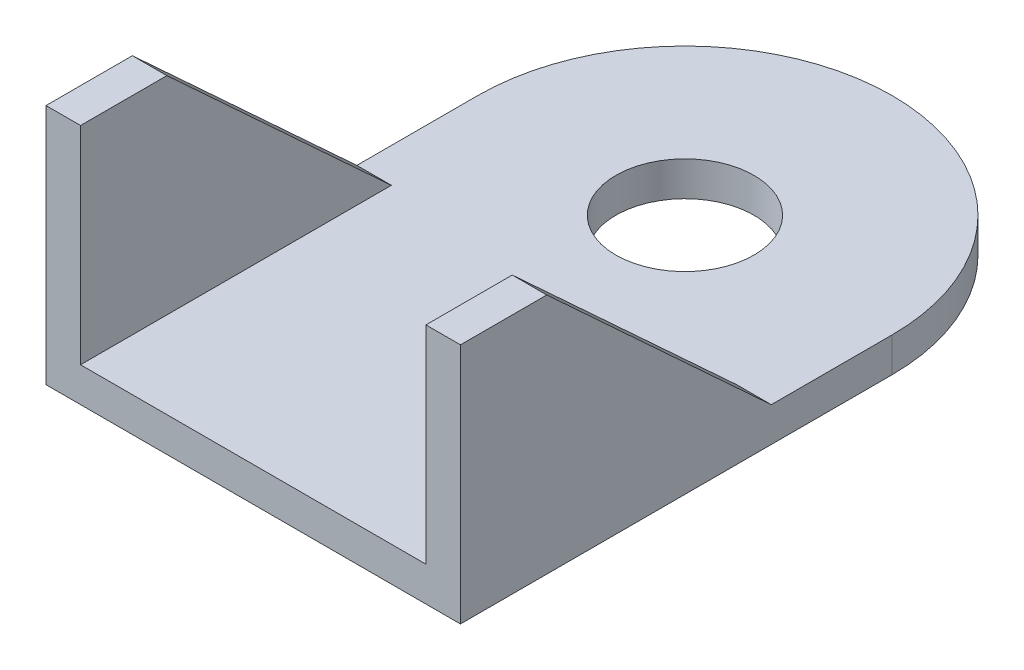
ISO-10303-21;
HEADER;
FILE_DESCRIPTION(('STEP AP214'),'2;1');
FILE_NAME('part.step','',(''),(''),'','','');
FILE_SCHEMA(('AUTOMOTIVE_DESIGN { 1 0 10303 214 1 1 1 1 }'));
ENDSEC;
DATA;
#1=APPLICATION_CONTEXT('core data for automotive mechanical design processes');
#2=APPLICATION_PROTOCOL_DEFINITION('international standard','automotive_design',2000,#1);
#3=PRODUCT_CONTEXT('',#1,'mechanical');
#4=PRODUCT('Part','Part','',(#3));
#5=PRODUCT_RELATED_PRODUCT_CATEGORY('part','',(#4));
#6=PRODUCT_DEFINITION_FORMATION('','',#4);
#7=PRODUCT_DEFINITION_CONTEXT('part definition',#1,'design');
#8=PRODUCT_DEFINITION('design','',#6,#7);
#9=PRODUCT_DEFINITION_SHAPE('','',#8);
#10=(LENGTH_UNIT() NAMED_UNIT(*) SI_UNIT(.MILLI.,.METRE.));
#11=(NAMED_UNIT(*) PLANE_ANGLE_UNIT() SI_UNIT($,.RADIAN.));
#12=(NAMED_UNIT(*) SI_UNIT($,.STERADIAN.) SOLID_ANGLE_UNIT());
#13=UNCERTAINTY_MEASURE_WITH_UNIT(LENGTH_MEASURE(1.E-05),#10,'distance_accuracy_value','');
#14=(GEOMETRIC_REPRESENTATION_CONTEXT(3) GLOBAL_UNCERTAINTY_ASSIGNED_CONTEXT((#13)) GLOBAL_UNIT_ASSIGNED_CONTEXT((#10,
#11,#12)) REPRESENTATION_CONTEXT('',''));
#15=CARTESIAN_POINT('',(0.,0.,0.));
#16=DIRECTION('',(0.,0.,1.));
#17=DIRECTION('',(1.,0.,0.));
#18=AXIS2_PLACEMENT_3D('',#15,#16,#17);
#19=CARTESIAN_POINT('',(0.,0.,0.));
#20=DIRECTION('',(0.,1.,0.));
#21=DIRECTION('',(0.,0.,1.));
#22=AXIS2_PLACEMENT_3D('',#19,#20,#21);
#23=PLANE('',#22);
#24=CARTESIAN_POINT('',(0.,0.,0.));
#25=DIRECTION('',(0.,1.,0.));
#26=DIRECTION('',(0.,0.,1.));
#27=AXIS2_PLACEMENT_3D('',#24,#25,#26);
#28=CIRCLE('',#27,12.);
#29=CARTESIAN_POINT('',(12.,0.,0.));
#30=VERTEX_POINT('',#29);
#31=CARTESIAN_POINT('',(-12.,0.,0.));
#32=VERTEX_POINT('',#31);
#33=EDGE_CURVE('E11',#30,#32,#28,.F.);
#34=ORIENTED_EDGE('',*,*,#33,.F.);
#35=DIRECTION('',(0.,0.,-1.));
#36=VECTOR('',#35,1.);
#37=CARTESIAN_POINT('',(12.,0.,0.));
#38=LINE('',#37,#36);
#39=CARTESIAN_POINT('',(12.,0.,25.));
#40=VERTEX_POINT('',#39);
#41=EDGE_CURVE('E172',#40,#30,#38,.T.);
#42=ORIENTED_EDGE('',*,*,#41,.F.);
#43=DIRECTION('',(1.,0.,0.));
#44=VECTOR('',#43,1.);
#45=CARTESIAN_POINT('',(0.,0.,25.));
#46=LINE('',#45,#44);
#47=CARTESIAN_POINT('',(-12.,0.,25.));
#48=VERTEX_POINT('',#47);
#49=EDGE_CURVE('E193',#48,#40,#46,.T.);
#50=ORIENTED_EDGE('',*,*,#49,.F.);
#51=DIRECTION('',(0.,0.,1.));
#52=VECTOR('',#51,1.);
#53=CARTESIAN_POINT('',(-12.,0.,0.));
#54=LINE('',#53,#52);
#55=EDGE_CURVE('E191',#32,#48,#54,.T.);
#56=ORIENTED_EDGE('',*,*,#55,.F.);
#57=EDGE_LOOP('',(#34,#42,#50,#56));
#58=FACE_BOUND('',#57,.T.);
#59=ADVANCED_FACE('F40',(#58),#23,.F.);
#60=CARTESIAN_POINT('',(0.,0.,0.));
#61=DIRECTION('',(0.,1.,0.));
#62=DIRECTION('',(0.,0.,1.));
#63=AXIS2_PLACEMENT_3D('',#60,#61,#62);
#64=CIRCLE('',#63,12.);
#65=EDGE_CURVE('E188',#30,#32,#64,.T.);
#66=ORIENTED_EDGE('',*,*,#65,.F.);
#67=ORIENTED_EDGE('',*,*,#33,.T.);
#68=EDGE_LOOP('',(#66,#67));
#69=FACE_BOUND('',#68,.T.);
#70=CARTESIAN_POINT('',(0.,0.,0.));
#71=DIRECTION('',(0.,1.,0.));
#72=DIRECTION('',(0.,0.,1.));
#73=AXIS2_PLACEMENT_3D('',#70,#71,#72);
#74=CIRCLE('',#73,9.);
#75=CARTESIAN_POINT('',(0.,0.,9.));
#76=VERTEX_POINT('',#75);
#77=EDGE_CURVE('E49',#76,#76,#74,.F.);
#78=ORIENTED_EDGE('',*,*,#77,.F.);
#79=EDGE_LOOP('',(#78));
#80=FACE_BOUND('',#79,.T.);
#81=ADVANCED_FACE('F216',(#69,#80),#23,.F.);
#82=CARTESIAN_POINT('',(0.,2.,0.));
#83=DIRECTION('',(0.,1.,0.));
#84=DIRECTION('',(0.,0.,1.));
#85=AXIS2_PLACEMENT_3D('',#82,#83,#84);
#86=PLANE('',#85);
#87=CARTESIAN_POINT('',(0.,2.,0.));
#88=DIRECTION('',(0.,1.,0.));
#89=DIRECTION('',(0.,0.,1.));
#90=AXIS2_PLACEMENT_3D('',#87,#88,#89);
#91=CIRCLE('',#90,4.);
#92=CARTESIAN_POINT('',(0.,2.,4.));
#93=VERTEX_POINT('',#92);
#94=EDGE_CURVE('E126',#93,#93,#91,.T.);
#95=ORIENTED_EDGE('',*,*,#94,.F.);
#96=EDGE_LOOP('',(#95));
#97=FACE_BOUND('',#96,.T.);
#98=DIRECTION('',(0.,0.,1.));
#99=VECTOR('',#98,1.);
#100=CARTESIAN_POINT('',(-12.,2.,0.));
#101=LINE('',#100,#99);
#102=CARTESIAN_POINT('',(-12.,2.,0.));
#103=VERTEX_POINT('',#102);
#104=CARTESIAN_POINT('',(-12.,2.,7.));
#105=VERTEX_POINT('',#104);
#106=EDGE_CURVE('E61',#103,#105,#101,.T.);
#107=ORIENTED_EDGE('',*,*,#106,.T.);
#108=DIRECTION('',(-1.,0.,0.));
#109=VECTOR('',#108,1.);
#110=CARTESIAN_POINT('',(-10.,2.,7.));
#111=LINE('',#110,#109);
#112=CARTESIAN_POINT('',(-10.,2.,7.));
#113=VERTEX_POINT('',#112);
#114=EDGE_CURVE('E56',#113,#105,#111,.T.);
#115=ORIENTED_EDGE('',*,*,#114,.F.);
#116=DIRECTION('',(0.,0.,-1.));
#117=VECTOR('',#116,1.);
#118=CARTESIAN_POINT('',(-10.,2.,7.));
#119=LINE('',#118,#117);
#120=CARTESIAN_POINT('',(-10.,2.,25.));
#121=VERTEX_POINT('',#120);
#122=EDGE_CURVE('E129',#121,#113,#119,.T.);
#123=ORIENTED_EDGE('',*,*,#122,.F.);
#124=DIRECTION('',(1.,0.,0.));
#125=VECTOR('',#124,1.);
#126=CARTESIAN_POINT('',(0.,2.,25.));
#127=LINE('',#126,#125);
#128=CARTESIAN_POINT('',(10.,2.,25.));
#129=VERTEX_POINT('',#128);
#130=EDGE_CURVE('E117',#121,#129,#127,.T.);
#131=ORIENTED_EDGE('',*,*,#130,.T.);
#132=DIRECTION('',(0.,0.,-1.));
#133=VECTOR('',#132,1.);
#134=CARTESIAN_POINT('',(10.,2.,7.));
#135=LINE('',#134,#133);
#136=CARTESIAN_POINT('',(10.,2.,7.));
#137=VERTEX_POINT('',#136);
#138=EDGE_CURVE('E154',#129,#137,#135,.T.);
#139=ORIENTED_EDGE('',*,*,#138,.T.);
#140=DIRECTION('',(1.,0.,0.));
#141=VECTOR('',#140,1.);
#142=CARTESIAN_POINT('',(10.,2.,7.));
#143=LINE('',#142,#141);
#144=CARTESIAN_POINT('',(12.,2.,7.));
#145=VERTEX_POINT('',#144);
#146=EDGE_CURVE('E164',#137,#145,#143,.T.);
#147=ORIENTED_EDGE('',*,*,#146,.T.);
#148=DIRECTION('',(0.,0.,-1.));
#149=VECTOR('',#148,1.);
#150=CARTESIAN_POINT('',(12.,2.,0.));
#151=LINE('',#150,#149);
#152=CARTESIAN_POINT('',(12.,2.,0.));
#153=VERTEX_POINT('',#152);
#154=EDGE_CURVE('E177',#145,#153,#151,.T.);
#155=ORIENTED_EDGE('',*,*,#154,.T.);
#156=CARTESIAN_POINT('',(0.,2.,0.));
#157=DIRECTION('',(0.,1.,0.));
#158=DIRECTION('',(0.,0.,1.));
#159=AXIS2_PLACEMENT_3D('',#156,#157,#158);
#160=CIRCLE('',#159,12.);
#161=EDGE_CURVE('E179',#153,#103,#160,.T.);
#162=ORIENTED_EDGE('',*,*,#161,.T.);
#163=EDGE_LOOP('',(#107,#115,#123,#131,#139,#147,#155,#162));
#164=FACE_BOUND('',#163,.T.);
#165=ADVANCED_FACE('F130',(#97,#164),#86,.T.);
#166=CARTESIAN_POINT('',(12.,2.,0.));
#167=DIRECTION('',(-1.,0.,0.));
#168=DIRECTION('',(0.,0.,1.));
#169=AXIS2_PLACEMENT_3D('',#166,#167,#168);
#170=PLANE('',#169);
#171=ORIENTED_EDGE('',*,*,#41,.T.);
#172=DIRECTION('',(0.,-1.,0.));
#173=VECTOR('',#172,1.);
#174=CARTESIAN_POINT('',(12.,2.,0.));
#175=LINE('',#174,#173);
#176=EDGE_CURVE('E205',#153,#30,#175,.T.);
#177=ORIENTED_EDGE('',*,*,#176,.F.);
#178=ORIENTED_EDGE('',*,*,#154,.F.);
#179=DIRECTION('',(0.,0.678280102733066,0.734803444627488));
#180=VECTOR('',#179,1.);
#181=CARTESIAN_POINT('',(12.,14.,20.));
#182=LINE('',#181,#180);
#183=CARTESIAN_POINT('',(12.,14.,20.));
#184=VERTEX_POINT('',#183);
#185=EDGE_CURVE('E149',#145,#184,#182,.T.);
#186=ORIENTED_EDGE('',*,*,#185,.T.);
#187=DIRECTION('',(0.,0.,1.));
#188=VECTOR('',#187,1.);
#189=CARTESIAN_POINT('',(12.,14.,25.));
#190=LINE('',#189,#188);
#191=CARTESIAN_POINT('',(12.,14.,25.));
#192=VERTEX_POINT('',#191);
#193=EDGE_CURVE('E157',#184,#192,#190,.T.);
#194=ORIENTED_EDGE('',*,*,#193,.T.);
#195=DIRECTION('',(0.,-1.,0.));
#196=VECTOR('',#195,1.);
#197=CARTESIAN_POINT('',(12.,2.,25.));
#198=LINE('',#197,#196);
#199=EDGE_CURVE('E185',#192,#40,#198,.T.);
#200=ORIENTED_EDGE('',*,*,#199,.T.);
#201=EDGE_LOOP('',(#171,#177,#178,#186,#194,#200));
#202=FACE_BOUND('',#201,.T.);
#203=ADVANCED_FACE('F42',(#202),#170,.F.);
#204=CARTESIAN_POINT('',(0.,2.,0.));
#205=DIRECTION('',(0.,-1.,0.));
#206=DIRECTION('',(0.,0.,-1.));
#207=AXIS2_PLACEMENT_3D('',#204,#205,#206);
#208=CYLINDRICAL_SURFACE('',#207,12.);
#209=ORIENTED_EDGE('',*,*,#65,.T.);
#210=DIRECTION('',(0.,-1.,0.));
#211=VECTOR('',#210,1.);
#212=CARTESIAN_POINT('',(-12.,2.,0.));
#213=LINE('',#212,#211);
#214=EDGE_CURVE('E202',#103,#32,#213,.T.);
#215=ORIENTED_EDGE('',*,*,#214,.F.);
#216=ORIENTED_EDGE('',*,*,#161,.F.);
#217=ORIENTED_EDGE('',*,*,#176,.T.);
#218=EDGE_LOOP('',(#209,#215,#216,#217));
#219=FACE_BOUND('',#218,.T.);
#220=ADVANCED_FACE('F248',(#219),#208,.T.);
#221=CARTESIAN_POINT('',(-12.,2.,0.));
#222=DIRECTION('',(1.,0.,0.));
#223=DIRECTION('',(0.,0.,-1.));
#224=AXIS2_PLACEMENT_3D('',#221,#222,#223);
#225=PLANE('',#224);
#226=ORIENTED_EDGE('',*,*,#55,.T.);
#227=DIRECTION('',(0.,-1.,0.));
#228=VECTOR('',#227,1.);
#229=CARTESIAN_POINT('',(-12.,2.,25.));
#230=LINE('',#229,#228);
#231=CARTESIAN_POINT('',(-12.,14.,25.));
#232=VERTEX_POINT('',#231);
#233=EDGE_CURVE('E199',#232,#48,#230,.T.);
#234=ORIENTED_EDGE('',*,*,#233,.F.);
#235=DIRECTION('',(0.,0.,1.));
#236=VECTOR('',#235,1.);
#237=CARTESIAN_POINT('',(-12.,14.,25.));
#238=LINE('',#237,#236);
#239=CARTESIAN_POINT('',(-12.,14.,20.));
#240=VERTEX_POINT('',#239);
#241=EDGE_CURVE('E144',#240,#232,#238,.T.);
#242=ORIENTED_EDGE('',*,*,#241,.F.);
#243=DIRECTION('',(0.,0.678280102733066,0.734803444627488));
#244=VECTOR('',#243,1.);
#245=CARTESIAN_POINT('',(-12.,14.,20.));
#246=LINE('',#245,#244);
#247=EDGE_CURVE('E132',#105,#240,#246,.T.);
#248=ORIENTED_EDGE('',*,*,#247,.F.);
#249=ORIENTED_EDGE('',*,*,#106,.F.);
#250=ORIENTED_EDGE('',*,*,#214,.T.);
#251=EDGE_LOOP('',(#226,#234,#242,#248,#249,#250));
#252=FACE_BOUND('',#251,.T.);
#253=ADVANCED_FACE('F243',(#252),#225,.F.);
#254=CARTESIAN_POINT('',(0.,2.,25.));
#255=DIRECTION('',(0.,0.,-1.));
#256=DIRECTION('',(-1.,0.,0.));
#257=AXIS2_PLACEMENT_3D('',#254,#255,#256);
#258=PLANE('',#257);
#259=ORIENTED_EDGE('',*,*,#49,.T.);
#260=ORIENTED_EDGE('',*,*,#199,.F.);
#261=DIRECTION('',(1.,0.,0.));
#262=VECTOR('',#261,1.);
#263=CARTESIAN_POINT('',(10.,14.,25.));
#264=LINE('',#263,#262);
#265=CARTESIAN_POINT('',(10.,14.,25.));
#266=VERTEX_POINT('',#265);
#267=EDGE_CURVE('E169',#266,#192,#264,.T.);
#268=ORIENTED_EDGE('',*,*,#267,.F.);
#269=DIRECTION('',(0.,-1.,0.));
#270=VECTOR('',#269,1.);
#271=CARTESIAN_POINT('',(10.,2.,25.));
#272=LINE('',#271,#270);
#273=EDGE_CURVE('E123',#266,#129,#272,.T.);
#274=ORIENTED_EDGE('',*,*,#273,.T.);
#275=ORIENTED_EDGE('',*,*,#130,.F.);
#276=DIRECTION('',(0.,-1.,0.));
#277=VECTOR('',#276,1.);
#278=CARTESIAN_POINT('',(-10.,2.,25.));
#279=LINE('',#278,#277);
#280=CARTESIAN_POINT('',(-10.,14.,25.));
#281=VERTEX_POINT('',#280);
#282=EDGE_CURVE('E121',#281,#121,#279,.T.);
#283=ORIENTED_EDGE('',*,*,#282,.F.);
#284=DIRECTION('',(-1.,0.,0.));
#285=VECTOR('',#284,1.);
#286=CARTESIAN_POINT('',(-10.,14.,25.));
#287=LINE('',#286,#285);
#288=EDGE_CURVE('E143',#281,#232,#287,.T.);
#289=ORIENTED_EDGE('',*,*,#288,.T.);
#290=ORIENTED_EDGE('',*,*,#233,.T.);
#291=EDGE_LOOP('',(#259,#260,#268,#274,#275,#283,#289,#290));
#292=FACE_BOUND('',#291,.T.);
#293=ADVANCED_FACE('F118',(#292),#258,.F.);
#294=CARTESIAN_POINT('',(0.,2.,0.));
#295=DIRECTION('',(0.,-1.,0.));
#296=DIRECTION('',(0.,0.,-1.));
#297=AXIS2_PLACEMENT_3D('',#294,#295,#296);
#298=CYLINDRICAL_SURFACE('',#297,4.);
#299=ORIENTED_EDGE('',*,*,#94,.T.);
#300=EDGE_LOOP('',(#299));
#301=FACE_BOUND('',#300,.T.);
#302=CARTESIAN_POINT('',(0.,0.,0.));
#303=DIRECTION('',(0.,1.,0.));
#304=DIRECTION('',(0.,0.,1.));
#305=AXIS2_PLACEMENT_3D('',#302,#303,#304);
#306=CIRCLE('',#305,4.);
#307=CARTESIAN_POINT('',(0.,0.,4.));
#308=VERTEX_POINT('',#307);
#309=EDGE_CURVE('E180',#308,#308,#306,.T.);
#310=ORIENTED_EDGE('',*,*,#309,.F.);
#311=EDGE_LOOP('',(#310));
#312=FACE_BOUND('',#311,.T.);
#313=ADVANCED_FACE('F231',(#301,#312),#298,.F.);
#314=ORIENTED_EDGE('',*,*,#77,.T.);
#315=EDGE_LOOP('',(#314));
#316=FACE_BOUND('',#315,.T.);
#317=ORIENTED_EDGE('',*,*,#309,.T.);
#318=EDGE_LOOP('',(#317));
#319=FACE_BOUND('',#318,.T.);
#320=ADVANCED_FACE('F213',(#316,#319),#23,.F.);
#321=CARTESIAN_POINT('',(10.,14.,25.));
#322=DIRECTION('',(0.,1.,0.));
#323=DIRECTION('',(0.,0.,1.));
#324=AXIS2_PLACEMENT_3D('',#321,#322,#323);
#325=PLANE('',#324);
#326=ORIENTED_EDGE('',*,*,#193,.F.);
#327=DIRECTION('',(1.,0.,0.));
#328=VECTOR('',#327,1.);
#329=CARTESIAN_POINT('',(10.,14.,20.));
#330=LINE('',#329,#328);
#331=CARTESIAN_POINT('',(10.,14.,20.));
#332=VERTEX_POINT('',#331);
#333=EDGE_CURVE('E173',#332,#184,#330,.T.);
#334=ORIENTED_EDGE('',*,*,#333,.F.);
#335=DIRECTION('',(0.,0.,1.));
#336=VECTOR('',#335,1.);
#337=CARTESIAN_POINT('',(10.,14.,25.));
#338=LINE('',#337,#336);
#339=EDGE_CURVE('E160',#332,#266,#338,.T.);
#340=ORIENTED_EDGE('',*,*,#339,.T.);
#341=ORIENTED_EDGE('',*,*,#267,.T.);
#342=EDGE_LOOP('',(#326,#334,#340,#341));
#343=FACE_BOUND('',#342,.T.);
#344=ADVANCED_FACE('F230',(#343),#325,.T.);
#345=CARTESIAN_POINT('',(10.,14.,20.));
#346=DIRECTION('',(0.,0.734803444627488,-0.678280102733066));
#347=DIRECTION('',(0.,0.678280102733066,0.734803444627488));
#348=AXIS2_PLACEMENT_3D('',#345,#346,#347);
#349=PLANE('',#348);
#350=ORIENTED_EDGE('',*,*,#185,.F.);
#351=ORIENTED_EDGE('',*,*,#146,.F.);
#352=DIRECTION('',(0.,0.678280102733066,0.734803444627488));
#353=VECTOR('',#352,1.);
#354=CARTESIAN_POINT('',(10.,14.,20.));
#355=LINE('',#354,#353);
#356=EDGE_CURVE('E156',#137,#332,#355,.T.);
#357=ORIENTED_EDGE('',*,*,#356,.T.);
#358=ORIENTED_EDGE('',*,*,#333,.T.);
#359=EDGE_LOOP('',(#350,#351,#357,#358));
#360=FACE_BOUND('',#359,.T.);
#361=ADVANCED_FACE('F236',(#360),#349,.T.);
#362=CARTESIAN_POINT('',(10.,0.,0.));
#363=DIRECTION('',(-1.,0.,0.));
#364=DIRECTION('',(0.,0.,1.));
#365=AXIS2_PLACEMENT_3D('',#362,#363,#364);
#366=PLANE('',#365);
#367=ORIENTED_EDGE('',*,*,#138,.F.);
#368=ORIENTED_EDGE('',*,*,#273,.F.);
#369=ORIENTED_EDGE('',*,*,#339,.F.);
#370=ORIENTED_EDGE('',*,*,#356,.F.);
#371=EDGE_LOOP('',(#367,#368,#369,#370));
#372=FACE_BOUND('',#371,.T.);
#373=ADVANCED_FACE('F267',(#372),#366,.T.);
#374=CARTESIAN_POINT('',(-10.,14.,20.));
#375=DIRECTION('',(0.,-0.734803444627488,0.678280102733066));
#376=DIRECTION('',(0.,-0.678280102733066,-0.734803444627488));
#377=AXIS2_PLACEMENT_3D('',#374,#375,#376);
#378=PLANE('',#377);
#379=ORIENTED_EDGE('',*,*,#247,.T.);
#380=DIRECTION('',(-1.,0.,0.));
#381=VECTOR('',#380,1.);
#382=CARTESIAN_POINT('',(-10.,14.,20.));
#383=LINE('',#382,#381);
#384=CARTESIAN_POINT('',(-10.,14.,20.));
#385=VERTEX_POINT('',#384);
#386=EDGE_CURVE('E150',#385,#240,#383,.T.);
#387=ORIENTED_EDGE('',*,*,#386,.F.);
#388=DIRECTION('',(0.,0.678280102733066,0.734803444627488));
#389=VECTOR('',#388,1.);
#390=CARTESIAN_POINT('',(-10.,14.,20.));
#391=LINE('',#390,#389);
#392=EDGE_CURVE('E139',#113,#385,#391,.T.);
#393=ORIENTED_EDGE('',*,*,#392,.F.);
#394=ORIENTED_EDGE('',*,*,#114,.T.);
#395=EDGE_LOOP('',(#379,#387,#393,#394));
#396=FACE_BOUND('',#395,.T.);
#397=ADVANCED_FACE('F274',(#396),#378,.F.);
#398=CARTESIAN_POINT('',(-10.,14.,25.));
#399=DIRECTION('',(0.,-1.,0.));
#400=DIRECTION('',(0.,0.,-1.));
#401=AXIS2_PLACEMENT_3D('',#398,#399,#400);
#402=PLANE('',#401);
#403=ORIENTED_EDGE('',*,*,#241,.T.);
#404=ORIENTED_EDGE('',*,*,#288,.F.);
#405=DIRECTION('',(0.,0.,1.));
#406=VECTOR('',#405,1.);
#407=CARTESIAN_POINT('',(-10.,14.,25.));
#408=LINE('',#407,#406);
#409=EDGE_CURVE('E136',#385,#281,#408,.T.);
#410=ORIENTED_EDGE('',*,*,#409,.F.);
#411=ORIENTED_EDGE('',*,*,#386,.T.);
#412=EDGE_LOOP('',(#403,#404,#410,#411));
#413=FACE_BOUND('',#412,.T.);
#414=ADVANCED_FACE('F277',(#413),#402,.F.);
#415=CARTESIAN_POINT('',(-10.,0.,0.));
#416=DIRECTION('',(1.,0.,0.));
#417=DIRECTION('',(0.,0.,1.));
#418=AXIS2_PLACEMENT_3D('',#415,#416,#417);
#419=PLANE('',#418);
#420=ORIENTED_EDGE('',*,*,#122,.T.);
#421=ORIENTED_EDGE('',*,*,#392,.T.);
#422=ORIENTED_EDGE('',*,*,#409,.T.);
#423=ORIENTED_EDGE('',*,*,#282,.T.);
#424=EDGE_LOOP('',(#420,#421,#422,#423));
#425=FACE_BOUND('',#424,.T.);
#426=ADVANCED_FACE('F134',(#425),#419,.T.);
#427=CLOSED_SHELL('',(#59,#81,#165,#203,#220,#253,#293,#313,#320,#344,#361,#373,#397,#414,#426));
#428=MANIFOLD_SOLID_BREP('B2',#427);
#429=ADVANCED_BREP_SHAPE_REPRESENTATION('',(#18,#428),#14);
#430=SHAPE_DEFINITION_REPRESENTATION(#9,#429);
ENDSEC;
END-ISO-10303-21;
